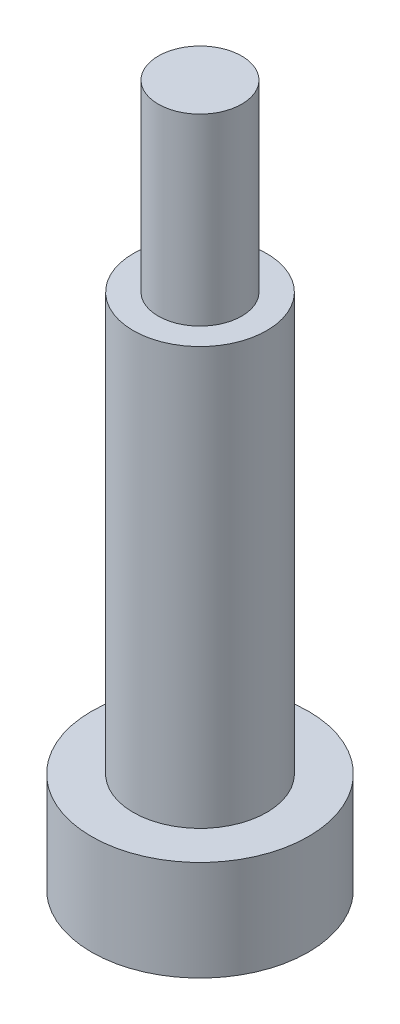
ISO-10303-21;
HEADER;
FILE_DESCRIPTION(('STEP AP214'),'2;1');
FILE_NAME('part.step','',(''),(''),'','','');
FILE_SCHEMA(('AUTOMOTIVE_DESIGN { 1 0 10303 214 1 1 1 1 }'));
ENDSEC;
DATA;
#1=APPLICATION_CONTEXT('core data for automotive mechanical design processes');
#2=APPLICATION_PROTOCOL_DEFINITION('international standard','automotive_design',2000,#1);
#3=PRODUCT_CONTEXT('',#1,'mechanical');
#4=PRODUCT('Part','Part','',(#3));
#5=PRODUCT_RELATED_PRODUCT_CATEGORY('part','',(#4));
#6=PRODUCT_DEFINITION_FORMATION('','',#4);
#7=PRODUCT_DEFINITION_CONTEXT('part definition',#1,'design');
#8=PRODUCT_DEFINITION('design','',#6,#7);
#9=PRODUCT_DEFINITION_SHAPE('','',#8);
#10=(LENGTH_UNIT() NAMED_UNIT(*) SI_UNIT(.MILLI.,.METRE.));
#11=(NAMED_UNIT(*) PLANE_ANGLE_UNIT() SI_UNIT($,.RADIAN.));
#12=(NAMED_UNIT(*) SI_UNIT($,.STERADIAN.) SOLID_ANGLE_UNIT());
#13=UNCERTAINTY_MEASURE_WITH_UNIT(LENGTH_MEASURE(1.E-05),#10,'distance_accuracy_value','');
#14=(GEOMETRIC_REPRESENTATION_CONTEXT(3) GLOBAL_UNCERTAINTY_ASSIGNED_CONTEXT((#13)) GLOBAL_UNIT_ASSIGNED_CONTEXT((#10,
#11,#12)) REPRESENTATION_CONTEXT('',''));
#15=CARTESIAN_POINT('',(0.,0.,0.));
#16=DIRECTION('',(0.,0.,1.));
#17=DIRECTION('',(1.,0.,0.));
#18=AXIS2_PLACEMENT_3D('',#15,#16,#17);
#19=CARTESIAN_POINT('',(152.4,7.825,336.55));
#20=DIRECTION('',(0.,-1.,0.));
#21=DIRECTION('',(0.,0.,-1.));
#22=AXIS2_PLACEMENT_3D('',#19,#20,#21);
#23=CYLINDRICAL_SURFACE('',#22,2.5);
#24=CARTESIAN_POINT('',(152.4,7.825,336.55));
#25=DIRECTION('',(0.,1.,0.));
#26=DIRECTION('',(0.,0.,1.));
#27=AXIS2_PLACEMENT_3D('',#24,#25,#26);
#28=CIRCLE('',#27,2.5);
#29=CARTESIAN_POINT('',(152.4,7.825,339.05));
#30=VERTEX_POINT('',#29);
#31=EDGE_CURVE('E10',#30,#30,#28,.T.);
#32=ORIENTED_EDGE('',*,*,#31,.F.);
#33=EDGE_LOOP('',(#32));
#34=FACE_BOUND('',#33,.T.);
#35=CARTESIAN_POINT('',(152.4,-3.175,336.55));
#36=DIRECTION('',(0.,1.,0.));
#37=DIRECTION('',(0.,0.,1.));
#38=AXIS2_PLACEMENT_3D('',#35,#36,#37);
#39=CIRCLE('',#38,2.5);
#40=CARTESIAN_POINT('',(152.4,-3.175,339.05));
#41=VERTEX_POINT('',#40);
#42=EDGE_CURVE('E46',#41,#41,#39,.T.);
#43=ORIENTED_EDGE('',*,*,#42,.T.);
#44=EDGE_LOOP('',(#43));
#45=FACE_BOUND('',#44,.T.);
#46=ADVANCED_FACE('F43',(#34,#45),#23,.T.);
#47=CARTESIAN_POINT('',(152.4,7.825,336.55));
#48=DIRECTION('',(0.,1.,0.));
#49=DIRECTION('',(0.,0.,1.));
#50=AXIS2_PLACEMENT_3D('',#47,#48,#49);
#51=PLANE('',#50);
#52=ORIENTED_EDGE('',*,*,#31,.T.);
#53=EDGE_LOOP('',(#52));
#54=FACE_BOUND('',#53,.T.);
#55=ADVANCED_FACE('F93',(#54),#51,.T.);
#56=CARTESIAN_POINT('',(152.4,-3.175,336.55));
#57=DIRECTION('',(0.,-1.,0.));
#58=DIRECTION('',(0.,0.,-1.));
#59=AXIS2_PLACEMENT_3D('',#56,#57,#58);
#60=CYLINDRICAL_SURFACE('',#59,4.);
#61=CARTESIAN_POINT('',(152.4,-3.175,336.55));
#62=DIRECTION('',(0.,1.,0.));
#63=DIRECTION('',(0.,0.,1.));
#64=AXIS2_PLACEMENT_3D('',#61,#62,#63);
#65=CIRCLE('',#64,4.);
#66=CARTESIAN_POINT('',(152.4,-3.175,340.55));
#67=VERTEX_POINT('',#66);
#68=EDGE_CURVE('E54',#67,#67,#65,.T.);
#69=ORIENTED_EDGE('',*,*,#68,.F.);
#70=EDGE_LOOP('',(#69));
#71=FACE_BOUND('',#70,.T.);
#72=CARTESIAN_POINT('',(152.4,-28.175,336.55));
#73=DIRECTION('',(0.,1.,0.));
#74=DIRECTION('',(0.,0.,1.));
#75=AXIS2_PLACEMENT_3D('',#72,#73,#74);
#76=CIRCLE('',#75,4.);
#77=CARTESIAN_POINT('',(152.4,-28.175,340.55));
#78=VERTEX_POINT('',#77);
#79=EDGE_CURVE('E60',#78,#78,#76,.T.);
#80=ORIENTED_EDGE('',*,*,#79,.T.);
#81=EDGE_LOOP('',(#80));
#82=FACE_BOUND('',#81,.T.);
#83=ADVANCED_FACE('F96',(#71,#82),#60,.T.);
#84=CARTESIAN_POINT('',(152.4,-3.175,336.55));
#85=DIRECTION('',(0.,1.,0.));
#86=DIRECTION('',(0.,0.,1.));
#87=AXIS2_PLACEMENT_3D('',#84,#85,#86);
#88=PLANE('',#87);
#89=ORIENTED_EDGE('',*,*,#42,.F.);
#90=EDGE_LOOP('',(#89));
#91=FACE_BOUND('',#90,.T.);
#92=ORIENTED_EDGE('',*,*,#68,.T.);
#93=EDGE_LOOP('',(#92));
#94=FACE_BOUND('',#93,.T.);
#95=ADVANCED_FACE('F105',(#91,#94),#88,.T.);
#96=CARTESIAN_POINT('',(152.4,-28.175,336.55));
#97=DIRECTION('',(0.,-1.,0.));
#98=DIRECTION('',(0.,0.,-1.));
#99=AXIS2_PLACEMENT_3D('',#96,#97,#98);
#100=CYLINDRICAL_SURFACE('',#99,6.50000000000001);
#101=CARTESIAN_POINT('',(152.4,-28.175,336.55));
#102=DIRECTION('',(0.,1.,0.));
#103=DIRECTION('',(0.,0.,1.));
#104=AXIS2_PLACEMENT_3D('',#101,#102,#103);
#105=CIRCLE('',#104,6.50000000000001);
#106=CARTESIAN_POINT('',(152.4,-28.175,343.05));
#107=VERTEX_POINT('',#106);
#108=EDGE_CURVE('E62',#107,#107,#105,.T.);
#109=ORIENTED_EDGE('',*,*,#108,.F.);
#110=EDGE_LOOP('',(#109));
#111=FACE_BOUND('',#110,.T.);
#112=CARTESIAN_POINT('',(152.4,-34.175,336.55));
#113=DIRECTION('',(0.,1.,0.));
#114=DIRECTION('',(0.,0.,1.));
#115=AXIS2_PLACEMENT_3D('',#112,#113,#114);
#116=CIRCLE('',#115,6.50000000000001);
#117=CARTESIAN_POINT('',(152.4,-34.175,343.05));
#118=VERTEX_POINT('',#117);
#119=EDGE_CURVE('E63',#118,#118,#116,.T.);
#120=ORIENTED_EDGE('',*,*,#119,.T.);
#121=EDGE_LOOP('',(#120));
#122=FACE_BOUND('',#121,.T.);
#123=ADVANCED_FACE('F102',(#111,#122),#100,.T.);
#124=CARTESIAN_POINT('',(152.4,-28.175,336.55));
#125=DIRECTION('',(0.,1.,0.));
#126=DIRECTION('',(0.,0.,1.));
#127=AXIS2_PLACEMENT_3D('',#124,#125,#126);
#128=PLANE('',#127);
#129=ORIENTED_EDGE('',*,*,#79,.F.);
#130=EDGE_LOOP('',(#129));
#131=FACE_BOUND('',#130,.T.);
#132=ORIENTED_EDGE('',*,*,#108,.T.);
#133=EDGE_LOOP('',(#132));
#134=FACE_BOUND('',#133,.T.);
#135=ADVANCED_FACE('F112',(#131,#134),#128,.T.);
#136=CARTESIAN_POINT('',(152.4,-34.175,336.55));
#137=DIRECTION('',(0.,1.,0.));
#138=DIRECTION('',(0.,0.,1.));
#139=AXIS2_PLACEMENT_3D('',#136,#137,#138);
#140=PLANE('',#139);
#141=CARTESIAN_POINT('',(152.4,-34.175,336.55));
#142=DIRECTION('',(0.,1.,0.));
#143=DIRECTION('',(0.,0.,1.));
#144=AXIS2_PLACEMENT_3D('',#141,#142,#143);
#145=CIRCLE('',#144,2.86);
#146=CARTESIAN_POINT('',(152.4,-34.175,339.41));
#147=VERTEX_POINT('',#146);
#148=EDGE_CURVE('E73',#147,#147,#145,.T.);
#149=ORIENTED_EDGE('',*,*,#148,.T.);
#150=EDGE_LOOP('',(#149));
#151=FACE_BOUND('',#150,.T.);
#152=ORIENTED_EDGE('',*,*,#119,.F.);
#153=EDGE_LOOP('',(#152));
#154=FACE_BOUND('',#153,.T.);
#155=ADVANCED_FACE('F89',(#151,#154),#140,.F.);
#156=CARTESIAN_POINT('',(152.4,-30.575,336.55));
#157=DIRECTION('',(0.,-1.,0.));
#158=DIRECTION('',(0.,0.,-1.));
#159=AXIS2_PLACEMENT_3D('',#156,#157,#158);
#160=CYLINDRICAL_SURFACE('',#159,2.86);
#161=CARTESIAN_POINT('',(152.4,-30.575,336.55));
#162=DIRECTION('',(0.,1.,0.));
#163=DIRECTION('',(0.,0.,1.));
#164=AXIS2_PLACEMENT_3D('',#161,#162,#163);
#165=CIRCLE('',#164,2.86);
#166=CARTESIAN_POINT('',(152.4,-30.575,339.41));
#167=VERTEX_POINT('',#166);
#168=EDGE_CURVE('E67',#167,#167,#165,.T.);
#169=ORIENTED_EDGE('',*,*,#168,.T.);
#170=EDGE_LOOP('',(#169));
#171=FACE_BOUND('',#170,.T.);
#172=ORIENTED_EDGE('',*,*,#148,.F.);
#173=EDGE_LOOP('',(#172));
#174=FACE_BOUND('',#173,.T.);
#175=ADVANCED_FACE('F82',(#171,#174),#160,.F.);
#176=CARTESIAN_POINT('',(152.4,-30.575,336.55));
#177=DIRECTION('',(0.,1.,0.));
#178=DIRECTION('',(0.,0.,1.));
#179=AXIS2_PLACEMENT_3D('',#176,#177,#178);
#180=PLANE('',#179);
#181=ORIENTED_EDGE('',*,*,#168,.F.);
#182=EDGE_LOOP('',(#181));
#183=FACE_BOUND('',#182,.T.);
#184=ADVANCED_FACE('F81',(#183),#180,.F.);
#185=CLOSED_SHELL('',(#46,#55,#83,#95,#123,#135,#155,#175,#184));
#186=MANIFOLD_SOLID_BREP('B2',#185);
#187=ADVANCED_BREP_SHAPE_REPRESENTATION('',(#18,#186),#14);
#188=SHAPE_DEFINITION_REPRESENTATION(#9,#187);
ENDSEC;
END-ISO-10303-21;
